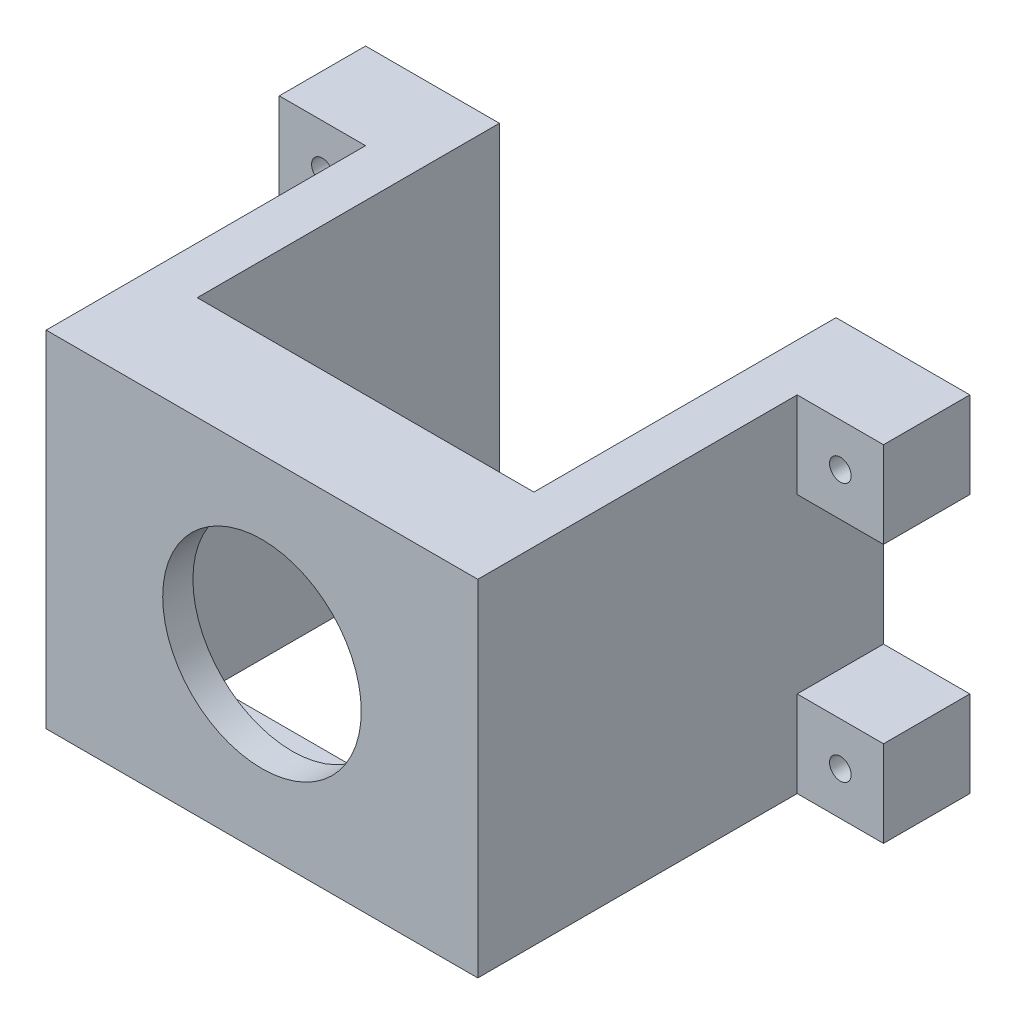
ISO-10303-21;
HEADER;
FILE_DESCRIPTION(('STEP AP214'),'2;1');
FILE_NAME('part.step','',(''),(''),'','','');
FILE_SCHEMA(('AUTOMOTIVE_DESIGN { 1 0 10303 214 1 1 1 1 }'));
ENDSEC;
DATA;
#1=APPLICATION_CONTEXT('core data for automotive mechanical design processes');
#2=APPLICATION_PROTOCOL_DEFINITION('international standard','automotive_design',2000,#1);
#3=PRODUCT_CONTEXT('',#1,'mechanical');
#4=PRODUCT('Part','Part','',(#3));
#5=PRODUCT_RELATED_PRODUCT_CATEGORY('part','',(#4));
#6=PRODUCT_DEFINITION_FORMATION('','',#4);
#7=PRODUCT_DEFINITION_CONTEXT('part definition',#1,'design');
#8=PRODUCT_DEFINITION('design','',#6,#7);
#9=PRODUCT_DEFINITION_SHAPE('','',#8);
#10=(LENGTH_UNIT() NAMED_UNIT(*) SI_UNIT(.MILLI.,.METRE.));
#11=(NAMED_UNIT(*) PLANE_ANGLE_UNIT() SI_UNIT($,.RADIAN.));
#12=(NAMED_UNIT(*) SI_UNIT($,.STERADIAN.) SOLID_ANGLE_UNIT());
#13=UNCERTAINTY_MEASURE_WITH_UNIT(LENGTH_MEASURE(1.E-05),#10,'distance_accuracy_value','');
#14=(GEOMETRIC_REPRESENTATION_CONTEXT(3) GLOBAL_UNCERTAINTY_ASSIGNED_CONTEXT((#13)) GLOBAL_UNIT_ASSIGNED_CONTEXT((#10,
#11,#12)) REPRESENTATION_CONTEXT('',''));
#15=CARTESIAN_POINT('',(0.,0.,0.));
#16=DIRECTION('',(0.,0.,1.));
#17=DIRECTION('',(1.,0.,0.));
#18=AXIS2_PLACEMENT_3D('',#15,#16,#17);
#19=CARTESIAN_POINT('',(0.,0.,0.));
#20=DIRECTION('',(0.,0.,1.));
#21=DIRECTION('',(1.,0.,0.));
#22=AXIS2_PLACEMENT_3D('',#19,#20,#21);
#23=PLANE('',#22);
#24=CARTESIAN_POINT('',(-30.,-15.,0.));
#25=DIRECTION('',(0.,0.,1.));
#26=DIRECTION('',(1.,0.,0.));
#27=AXIS2_PLACEMENT_3D('',#24,#25,#26);
#28=CIRCLE('',#27,1.25);
#29=CARTESIAN_POINT('',(-28.75,-15.,0.));
#30=VERTEX_POINT('',#29);
#31=EDGE_CURVE('E408',#30,#30,#28,.T.);
#32=ORIENTED_EDGE('',*,*,#31,.T.);
#33=EDGE_LOOP('',(#32));
#34=FACE_BOUND('',#33,.T.);
#35=CARTESIAN_POINT('',(-30.,15.,0.));
#36=DIRECTION('',(0.,0.,1.));
#37=DIRECTION('',(1.,0.,0.));
#38=AXIS2_PLACEMENT_3D('',#35,#36,#37);
#39=CIRCLE('',#38,1.25);
#40=CARTESIAN_POINT('',(-28.75,15.,0.));
#41=VERTEX_POINT('',#40);
#42=EDGE_CURVE('E361',#41,#41,#39,.T.);
#43=ORIENTED_EDGE('',*,*,#42,.T.);
#44=EDGE_LOOP('',(#43));
#45=FACE_BOUND('',#44,.T.);
#46=DIRECTION('',(-1.,0.,0.));
#47=VECTOR('',#46,1.);
#48=CARTESIAN_POINT('',(-25.,20.,0.));
#49=LINE('',#48,#47);
#50=CARTESIAN_POINT('',(-19.5,20.,0.));
#51=VERTEX_POINT('',#50);
#52=CARTESIAN_POINT('',(-35.,20.,0.));
#53=VERTEX_POINT('',#52);
#54=EDGE_CURVE('E204',#51,#53,#49,.T.);
#55=ORIENTED_EDGE('',*,*,#54,.F.);
#56=DIRECTION('',(0.,-1.,0.));
#57=VECTOR('',#56,1.);
#58=CARTESIAN_POINT('',(-19.5,18.,0.));
#59=LINE('',#58,#57);
#60=CARTESIAN_POINT('',(-19.5,-20.,0.));
#61=VERTEX_POINT('',#60);
#62=EDGE_CURVE('E215',#51,#61,#59,.T.);
#63=ORIENTED_EDGE('',*,*,#62,.T.);
#64=DIRECTION('',(1.,0.,0.));
#65=VECTOR('',#64,1.);
#66=CARTESIAN_POINT('',(-25.,-20.,0.));
#67=LINE('',#66,#65);
#68=CARTESIAN_POINT('',(-35.,-20.,0.));
#69=VERTEX_POINT('',#68);
#70=EDGE_CURVE('E237',#69,#61,#67,.T.);
#71=ORIENTED_EDGE('',*,*,#70,.F.);
#72=DIRECTION('',(0.,-1.,0.));
#73=VECTOR('',#72,1.);
#74=CARTESIAN_POINT('',(-35.,-10.,0.));
#75=LINE('',#74,#73);
#76=CARTESIAN_POINT('',(-35.,-10.,0.));
#77=VERTEX_POINT('',#76);
#78=EDGE_CURVE('E274',#77,#69,#75,.T.);
#79=ORIENTED_EDGE('',*,*,#78,.F.);
#80=DIRECTION('',(-1.,0.,0.));
#81=VECTOR('',#80,1.);
#82=CARTESIAN_POINT('',(-35.,-10.,0.));
#83=LINE('',#82,#81);
#84=CARTESIAN_POINT('',(-25.,-10.,0.));
#85=VERTEX_POINT('',#84);
#86=EDGE_CURVE('E287',#85,#77,#83,.T.);
#87=ORIENTED_EDGE('',*,*,#86,.F.);
#88=DIRECTION('',(0.,-1.,0.));
#89=VECTOR('',#88,1.);
#90=CARTESIAN_POINT('',(-25.,20.,0.));
#91=LINE('',#90,#89);
#92=CARTESIAN_POINT('',(-25.,10.,0.));
#93=VERTEX_POINT('',#92);
#94=EDGE_CURVE('E230',#93,#85,#91,.T.);
#95=ORIENTED_EDGE('',*,*,#94,.F.);
#96=DIRECTION('',(-1.,0.,0.));
#97=VECTOR('',#96,1.);
#98=CARTESIAN_POINT('',(-35.,10.,0.));
#99=LINE('',#98,#97);
#100=CARTESIAN_POINT('',(-35.,10.,0.));
#101=VERTEX_POINT('',#100);
#102=EDGE_CURVE('E363',#93,#101,#99,.T.);
#103=ORIENTED_EDGE('',*,*,#102,.T.);
#104=DIRECTION('',(0.,1.,0.));
#105=VECTOR('',#104,1.);
#106=CARTESIAN_POINT('',(-35.,10.,0.));
#107=LINE('',#106,#105);
#108=EDGE_CURVE('E226',#101,#53,#107,.T.);
#109=ORIENTED_EDGE('',*,*,#108,.T.);
#110=EDGE_LOOP('',(#55,#63,#71,#79,#87,#95,#103,#109));
#111=FACE_BOUND('',#110,.T.);
#112=ADVANCED_FACE('F42',(#34,#45,#111),#23,.F.);
#113=CARTESIAN_POINT('',(30.,-15.,0.));
#114=DIRECTION('',(0.,0.,1.));
#115=DIRECTION('',(1.,0.,0.));
#116=AXIS2_PLACEMENT_3D('',#113,#114,#115);
#117=CIRCLE('',#116,1.25);
#118=CARTESIAN_POINT('',(31.25,-15.,0.));
#119=VERTEX_POINT('',#118);
#120=EDGE_CURVE('E402',#119,#119,#117,.T.);
#121=ORIENTED_EDGE('',*,*,#120,.T.);
#122=EDGE_LOOP('',(#121));
#123=FACE_BOUND('',#122,.T.);
#124=CARTESIAN_POINT('',(30.,15.,0.));
#125=DIRECTION('',(0.,0.,1.));
#126=DIRECTION('',(1.,0.,0.));
#127=AXIS2_PLACEMENT_3D('',#124,#125,#126);
#128=CIRCLE('',#127,1.25);
#129=CARTESIAN_POINT('',(31.25,15.,0.));
#130=VERTEX_POINT('',#129);
#131=EDGE_CURVE('E811',#130,#130,#128,.T.);
#132=ORIENTED_EDGE('',*,*,#131,.T.);
#133=EDGE_LOOP('',(#132));
#134=FACE_BOUND('',#133,.T.);
#135=DIRECTION('',(0.,1.,0.));
#136=VECTOR('',#135,1.);
#137=CARTESIAN_POINT('',(19.5,18.,0.));
#138=LINE('',#137,#136);
#139=CARTESIAN_POINT('',(19.5,-20.,0.));
#140=VERTEX_POINT('',#139);
#141=CARTESIAN_POINT('',(19.5,20.,0.));
#142=VERTEX_POINT('',#141);
#143=EDGE_CURVE('E222',#140,#142,#138,.T.);
#144=ORIENTED_EDGE('',*,*,#143,.T.);
#145=CARTESIAN_POINT('',(35.,20.,0.));
#146=VERTEX_POINT('',#145);
#147=EDGE_CURVE('E227',#146,#142,#49,.T.);
#148=ORIENTED_EDGE('',*,*,#147,.F.);
#149=DIRECTION('',(0.,-1.,0.));
#150=VECTOR('',#149,1.);
#151=CARTESIAN_POINT('',(35.,10.,0.));
#152=LINE('',#151,#150);
#153=CARTESIAN_POINT('',(35.,10.,0.));
#154=VERTEX_POINT('',#153);
#155=EDGE_CURVE('E358',#146,#154,#152,.T.);
#156=ORIENTED_EDGE('',*,*,#155,.T.);
#157=CARTESIAN_POINT('',(25.,10.,0.));
#158=VERTEX_POINT('',#157);
#159=EDGE_CURVE('E348',#154,#158,#99,.T.);
#160=ORIENTED_EDGE('',*,*,#159,.T.);
#161=DIRECTION('',(0.,1.,0.));
#162=VECTOR('',#161,1.);
#163=CARTESIAN_POINT('',(25.,20.,0.));
#164=LINE('',#163,#162);
#165=CARTESIAN_POINT('',(25.,-10.,0.));
#166=VERTEX_POINT('',#165);
#167=EDGE_CURVE('E62',#166,#158,#164,.T.);
#168=ORIENTED_EDGE('',*,*,#167,.F.);
#169=CARTESIAN_POINT('',(35.,-10.,0.));
#170=VERTEX_POINT('',#169);
#171=EDGE_CURVE('E288',#170,#166,#83,.T.);
#172=ORIENTED_EDGE('',*,*,#171,.F.);
#173=DIRECTION('',(0.,1.,0.));
#174=VECTOR('',#173,1.);
#175=CARTESIAN_POINT('',(35.,-10.,0.));
#176=LINE('',#175,#174);
#177=CARTESIAN_POINT('',(35.,-20.,0.));
#178=VERTEX_POINT('',#177);
#179=EDGE_CURVE('E256',#178,#170,#176,.T.);
#180=ORIENTED_EDGE('',*,*,#179,.F.);
#181=EDGE_CURVE('E236',#140,#178,#67,.T.);
#182=ORIENTED_EDGE('',*,*,#181,.F.);
#183=EDGE_LOOP('',(#144,#148,#156,#160,#168,#172,#180,#182));
#184=FACE_BOUND('',#183,.T.);
#185=ADVANCED_FACE('F441',(#123,#134,#184),#23,.F.);
#186=CARTESIAN_POINT('',(-25.,20.,47.));
#187=DIRECTION('',(0.,-1.,0.));
#188=DIRECTION('',(0.,0.,-1.));
#189=AXIS2_PLACEMENT_3D('',#186,#187,#188);
#190=PLANE('',#189);
#191=DIRECTION('',(0.,0.,-1.));
#192=VECTOR('',#191,1.);
#193=CARTESIAN_POINT('',(-19.5,20.,47.));
#194=LINE('',#193,#192);
#195=CARTESIAN_POINT('',(-19.5,20.,35.));
#196=VERTEX_POINT('',#195);
#197=EDGE_CURVE('E200',#196,#51,#194,.T.);
#198=ORIENTED_EDGE('',*,*,#197,.T.);
#199=ORIENTED_EDGE('',*,*,#54,.T.);
#200=DIRECTION('',(0.,0.,-1.));
#201=VECTOR('',#200,1.);
#202=CARTESIAN_POINT('',(-35.,20.,10.));
#203=LINE('',#202,#201);
#204=CARTESIAN_POINT('',(-35.,20.,10.));
#205=VERTEX_POINT('',#204);
#206=EDGE_CURVE('E370',#205,#53,#203,.T.);
#207=ORIENTED_EDGE('',*,*,#206,.F.);
#208=DIRECTION('',(1.,0.,0.));
#209=VECTOR('',#208,1.);
#210=CARTESIAN_POINT('',(-35.,20.,10.));
#211=LINE('',#210,#209);
#212=CARTESIAN_POINT('',(-25.,20.,9.99999999999999));
#213=VERTEX_POINT('',#212);
#214=EDGE_CURVE('E344',#205,#213,#211,.T.);
#215=ORIENTED_EDGE('',*,*,#214,.T.);
#216=DIRECTION('',(0.,0.,-1.));
#217=VECTOR('',#216,1.);
#218=CARTESIAN_POINT('',(-25.,20.,47.));
#219=LINE('',#218,#217);
#220=CARTESIAN_POINT('',(-25.,20.,47.));
#221=VERTEX_POINT('',#220);
#222=EDGE_CURVE('E246',#221,#213,#219,.T.);
#223=ORIENTED_EDGE('',*,*,#222,.F.);
#224=DIRECTION('',(-1.,0.,0.));
#225=VECTOR('',#224,1.);
#226=CARTESIAN_POINT('',(-25.,20.,47.));
#227=LINE('',#226,#225);
#228=CARTESIAN_POINT('',(25.,20.,47.));
#229=VERTEX_POINT('',#228);
#230=EDGE_CURVE('E315',#229,#221,#227,.T.);
#231=ORIENTED_EDGE('',*,*,#230,.F.);
#232=DIRECTION('',(0.,0.,-1.));
#233=VECTOR('',#232,1.);
#234=CARTESIAN_POINT('',(25.,20.,47.));
#235=LINE('',#234,#233);
#236=CARTESIAN_POINT('',(25.,20.,9.99999999999999));
#237=VERTEX_POINT('',#236);
#238=EDGE_CURVE('E50',#229,#237,#235,.T.);
#239=ORIENTED_EDGE('',*,*,#238,.T.);
#240=CARTESIAN_POINT('',(35.,20.,10.));
#241=VERTEX_POINT('',#240);
#242=EDGE_CURVE('E334',#237,#241,#211,.T.);
#243=ORIENTED_EDGE('',*,*,#242,.T.);
#244=DIRECTION('',(0.,0.,-1.));
#245=VECTOR('',#244,1.);
#246=CARTESIAN_POINT('',(35.,20.,10.));
#247=LINE('',#246,#245);
#248=EDGE_CURVE('E372',#241,#146,#247,.T.);
#249=ORIENTED_EDGE('',*,*,#248,.T.);
#250=ORIENTED_EDGE('',*,*,#147,.T.);
#251=DIRECTION('',(0.,0.,1.));
#252=VECTOR('',#251,1.);
#253=CARTESIAN_POINT('',(19.5,20.,47.));
#254=LINE('',#253,#252);
#255=CARTESIAN_POINT('',(19.5,20.,35.));
#256=VERTEX_POINT('',#255);
#257=EDGE_CURVE('E397',#142,#256,#254,.T.);
#258=ORIENTED_EDGE('',*,*,#257,.T.);
#259=DIRECTION('',(1.,0.,0.));
#260=VECTOR('',#259,1.);
#261=CARTESIAN_POINT('',(-25.,20.,35.));
#262=LINE('',#261,#260);
#263=EDGE_CURVE('E207',#196,#256,#262,.T.);
#264=ORIENTED_EDGE('',*,*,#263,.F.);
#265=EDGE_LOOP('',(#198,#199,#207,#215,#223,#231,#239,#243,#249,#250,#258,#264));
#266=FACE_BOUND('',#265,.T.);
#267=ADVANCED_FACE('F202',(#266),#190,.F.);
#268=CARTESIAN_POINT('',(-19.5,18.,43.5));
#269=DIRECTION('',(0.,-1.,0.));
#270=DIRECTION('',(0.,0.,-1.));
#271=AXIS2_PLACEMENT_3D('',#268,#269,#270);
#272=PLANE('',#271);
#273=DIRECTION('',(0.,0.,-1.));
#274=VECTOR('',#273,1.);
#275=CARTESIAN_POINT('',(-19.5,18.,43.5));
#276=LINE('',#275,#274);
#277=CARTESIAN_POINT('',(-19.5,18.,43.5));
#278=VERTEX_POINT('',#277);
#279=CARTESIAN_POINT('',(-19.5,18.,35.));
#280=VERTEX_POINT('',#279);
#281=EDGE_CURVE('E259',#278,#280,#276,.T.);
#282=ORIENTED_EDGE('',*,*,#281,.T.);
#283=DIRECTION('',(1.,0.,0.));
#284=VECTOR('',#283,1.);
#285=CARTESIAN_POINT('',(-19.5,18.,35.));
#286=LINE('',#285,#284);
#287=CARTESIAN_POINT('',(19.5,18.,35.));
#288=VERTEX_POINT('',#287);
#289=EDGE_CURVE('E388',#280,#288,#286,.T.);
#290=ORIENTED_EDGE('',*,*,#289,.T.);
#291=DIRECTION('',(0.,0.,-1.));
#292=VECTOR('',#291,1.);
#293=CARTESIAN_POINT('',(19.5,18.,43.5));
#294=LINE('',#293,#292);
#295=CARTESIAN_POINT('',(19.5,18.,43.5));
#296=VERTEX_POINT('',#295);
#297=EDGE_CURVE('E252',#296,#288,#294,.T.);
#298=ORIENTED_EDGE('',*,*,#297,.F.);
#299=DIRECTION('',(-1.,0.,0.));
#300=VECTOR('',#299,1.);
#301=CARTESIAN_POINT('',(-19.5,18.,43.5));
#302=LINE('',#301,#300);
#303=EDGE_CURVE('E412',#296,#278,#302,.T.);
#304=ORIENTED_EDGE('',*,*,#303,.T.);
#305=EDGE_LOOP('',(#282,#290,#298,#304));
#306=FACE_BOUND('',#305,.T.);
#307=ADVANCED_FACE('F436',(#306),#272,.T.);
#308=CARTESIAN_POINT('',(-19.5,-18.,43.5));
#309=DIRECTION('',(0.,1.,0.));
#310=DIRECTION('',(0.,0.,1.));
#311=AXIS2_PLACEMENT_3D('',#308,#309,#310);
#312=PLANE('',#311);
#313=DIRECTION('',(0.,0.,-1.));
#314=VECTOR('',#313,1.);
#315=CARTESIAN_POINT('',(19.5,-18.,43.5));
#316=LINE('',#315,#314);
#317=CARTESIAN_POINT('',(19.5,-18.,43.5));
#318=VERTEX_POINT('',#317);
#319=CARTESIAN_POINT('',(19.5,-18.,35.));
#320=VERTEX_POINT('',#319);
#321=EDGE_CURVE('E418',#318,#320,#316,.T.);
#322=ORIENTED_EDGE('',*,*,#321,.T.);
#323=DIRECTION('',(-1.,0.,0.));
#324=VECTOR('',#323,1.);
#325=CARTESIAN_POINT('',(-19.5,-18.,35.));
#326=LINE('',#325,#324);
#327=CARTESIAN_POINT('',(-19.5,-18.,35.));
#328=VERTEX_POINT('',#327);
#329=EDGE_CURVE('E11',#320,#328,#326,.T.);
#330=ORIENTED_EDGE('',*,*,#329,.T.);
#331=DIRECTION('',(0.,0.,-1.));
#332=VECTOR('',#331,1.);
#333=CARTESIAN_POINT('',(-19.5,-18.,43.5));
#334=LINE('',#333,#332);
#335=CARTESIAN_POINT('',(-19.5,-18.,43.5));
#336=VERTEX_POINT('',#335);
#337=EDGE_CURVE('E266',#336,#328,#334,.T.);
#338=ORIENTED_EDGE('',*,*,#337,.F.);
#339=DIRECTION('',(1.,0.,0.));
#340=VECTOR('',#339,1.);
#341=CARTESIAN_POINT('',(-19.5,-18.,43.5));
#342=LINE('',#341,#340);
#343=EDGE_CURVE('E416',#336,#318,#342,.T.);
#344=ORIENTED_EDGE('',*,*,#343,.T.);
#345=EDGE_LOOP('',(#322,#330,#338,#344));
#346=FACE_BOUND('',#345,.T.);
#347=ADVANCED_FACE('F428',(#346),#312,.T.);
#348=CARTESIAN_POINT('',(25.,20.,47.));
#349=DIRECTION('',(-1.,0.,0.));
#350=DIRECTION('',(0.,0.,1.));
#351=AXIS2_PLACEMENT_3D('',#348,#349,#350);
#352=PLANE('',#351);
#353=ORIENTED_EDGE('',*,*,#167,.T.);
#354=DIRECTION('',(0.,0.,1.));
#355=VECTOR('',#354,1.);
#356=CARTESIAN_POINT('',(25.,10.,47.));
#357=LINE('',#356,#355);
#358=CARTESIAN_POINT('',(25.,10.,9.99999999999999));
#359=VERTEX_POINT('',#358);
#360=EDGE_CURVE('E57',#158,#359,#357,.T.);
#361=ORIENTED_EDGE('',*,*,#360,.T.);
#362=DIRECTION('',(0.,1.,0.));
#363=VECTOR('',#362,1.);
#364=CARTESIAN_POINT('',(25.,20.,9.99999999999999));
#365=LINE('',#364,#363);
#366=EDGE_CURVE('E331',#359,#237,#365,.T.);
#367=ORIENTED_EDGE('',*,*,#366,.T.);
#368=ORIENTED_EDGE('',*,*,#238,.F.);
#369=DIRECTION('',(0.,1.,0.));
#370=VECTOR('',#369,1.);
#371=CARTESIAN_POINT('',(25.,20.,47.));
#372=LINE('',#371,#370);
#373=CARTESIAN_POINT('',(25.,-20.,47.));
#374=VERTEX_POINT('',#373);
#375=EDGE_CURVE('E239',#374,#229,#372,.T.);
#376=ORIENTED_EDGE('',*,*,#375,.F.);
#377=DIRECTION('',(0.,0.,-1.));
#378=VECTOR('',#377,1.);
#379=CARTESIAN_POINT('',(25.,-20.,47.));
#380=LINE('',#379,#378);
#381=CARTESIAN_POINT('',(25.,-20.,9.99999999999999));
#382=VERTEX_POINT('',#381);
#383=EDGE_CURVE('E240',#374,#382,#380,.T.);
#384=ORIENTED_EDGE('',*,*,#383,.T.);
#385=DIRECTION('',(0.,1.,0.));
#386=VECTOR('',#385,1.);
#387=CARTESIAN_POINT('',(25.,20.,9.99999999999999));
#388=LINE('',#387,#386);
#389=CARTESIAN_POINT('',(25.,-10.,9.99999999999999));
#390=VERTEX_POINT('',#389);
#391=EDGE_CURVE('E231',#382,#390,#388,.T.);
#392=ORIENTED_EDGE('',*,*,#391,.T.);
#393=DIRECTION('',(0.,0.,1.));
#394=VECTOR('',#393,1.);
#395=CARTESIAN_POINT('',(25.,-10.,47.));
#396=LINE('',#395,#394);
#397=EDGE_CURVE('E307',#166,#390,#396,.T.);
#398=ORIENTED_EDGE('',*,*,#397,.F.);
#399=EDGE_LOOP('',(#353,#361,#367,#368,#376,#384,#392,#398));
#400=FACE_BOUND('',#399,.T.);
#401=ADVANCED_FACE('F44',(#400),#352,.F.);
#402=CARTESIAN_POINT('',(-25.,20.,47.));
#403=DIRECTION('',(1.,0.,0.));
#404=DIRECTION('',(0.,1.,0.));
#405=AXIS2_PLACEMENT_3D('',#402,#403,#404);
#406=PLANE('',#405);
#407=DIRECTION('',(0.,-1.,0.));
#408=VECTOR('',#407,1.);
#409=CARTESIAN_POINT('',(-25.,20.,9.99999999999999));
#410=LINE('',#409,#408);
#411=CARTESIAN_POINT('',(-25.,10.,9.99999999999999));
#412=VERTEX_POINT('',#411);
#413=EDGE_CURVE('E374',#213,#412,#410,.T.);
#414=ORIENTED_EDGE('',*,*,#413,.T.);
#415=DIRECTION('',(0.,0.,-1.));
#416=VECTOR('',#415,1.);
#417=CARTESIAN_POINT('',(-25.,10.,47.));
#418=LINE('',#417,#416);
#419=EDGE_CURVE('E377',#412,#93,#418,.T.);
#420=ORIENTED_EDGE('',*,*,#419,.T.);
#421=ORIENTED_EDGE('',*,*,#94,.T.);
#422=DIRECTION('',(0.,0.,-1.));
#423=VECTOR('',#422,1.);
#424=CARTESIAN_POINT('',(-25.,-10.,47.));
#425=LINE('',#424,#423);
#426=CARTESIAN_POINT('',(-25.,-10.,9.99999999999999));
#427=VERTEX_POINT('',#426);
#428=EDGE_CURVE('E304',#427,#85,#425,.T.);
#429=ORIENTED_EDGE('',*,*,#428,.F.);
#430=DIRECTION('',(0.,-1.,0.));
#431=VECTOR('',#430,1.);
#432=CARTESIAN_POINT('',(-25.,20.,9.99999999999999));
#433=LINE('',#432,#431);
#434=CARTESIAN_POINT('',(-25.,-20.,9.99999999999999));
#435=VERTEX_POINT('',#434);
#436=EDGE_CURVE('E310',#427,#435,#433,.T.);
#437=ORIENTED_EDGE('',*,*,#436,.T.);
#438=DIRECTION('',(0.,0.,-1.));
#439=VECTOR('',#438,1.);
#440=CARTESIAN_POINT('',(-25.,-20.,47.));
#441=LINE('',#440,#439);
#442=CARTESIAN_POINT('',(-25.,-20.,47.));
#443=VERTEX_POINT('',#442);
#444=EDGE_CURVE('E242',#443,#435,#441,.T.);
#445=ORIENTED_EDGE('',*,*,#444,.F.);
#446=DIRECTION('',(0.,-1.,0.));
#447=VECTOR('',#446,1.);
#448=CARTESIAN_POINT('',(-25.,20.,47.));
#449=LINE('',#448,#447);
#450=EDGE_CURVE('E317',#221,#443,#449,.T.);
#451=ORIENTED_EDGE('',*,*,#450,.F.);
#452=ORIENTED_EDGE('',*,*,#222,.T.);
#453=EDGE_LOOP('',(#414,#420,#421,#429,#437,#445,#451,#452));
#454=FACE_BOUND('',#453,.T.);
#455=ADVANCED_FACE('F474',(#454),#406,.F.);
#456=CARTESIAN_POINT('',(-25.,-20.,47.));
#457=DIRECTION('',(0.,1.,0.));
#458=DIRECTION('',(0.,0.,1.));
#459=AXIS2_PLACEMENT_3D('',#456,#457,#458);
#460=PLANE('',#459);
#461=ORIENTED_EDGE('',*,*,#70,.T.);
#462=DIRECTION('',(0.,0.,1.));
#463=VECTOR('',#462,1.);
#464=CARTESIAN_POINT('',(-19.5,-20.,47.));
#465=LINE('',#464,#463);
#466=CARTESIAN_POINT('',(-19.5,-20.,35.));
#467=VERTEX_POINT('',#466);
#468=EDGE_CURVE('E212',#61,#467,#465,.T.);
#469=ORIENTED_EDGE('',*,*,#468,.T.);
#470=DIRECTION('',(-1.,0.,0.));
#471=VECTOR('',#470,1.);
#472=CARTESIAN_POINT('',(-25.,-20.,35.));
#473=LINE('',#472,#471);
#474=CARTESIAN_POINT('',(19.5,-20.,35.));
#475=VERTEX_POINT('',#474);
#476=EDGE_CURVE('E391',#475,#467,#473,.T.);
#477=ORIENTED_EDGE('',*,*,#476,.F.);
#478=DIRECTION('',(0.,0.,-1.));
#479=VECTOR('',#478,1.);
#480=CARTESIAN_POINT('',(19.5,-20.,47.));
#481=LINE('',#480,#479);
#482=EDGE_CURVE('E394',#475,#140,#481,.T.);
#483=ORIENTED_EDGE('',*,*,#482,.T.);
#484=ORIENTED_EDGE('',*,*,#181,.T.);
#485=DIRECTION('',(0.,0.,-1.));
#486=VECTOR('',#485,1.);
#487=CARTESIAN_POINT('',(35.,-20.,10.));
#488=LINE('',#487,#486);
#489=CARTESIAN_POINT('',(35.,-20.,10.));
#490=VERTEX_POINT('',#489);
#491=EDGE_CURVE('E284',#490,#178,#488,.T.);
#492=ORIENTED_EDGE('',*,*,#491,.F.);
#493=DIRECTION('',(1.,0.,0.));
#494=VECTOR('',#493,1.);
#495=CARTESIAN_POINT('',(-35.,-20.,10.));
#496=LINE('',#495,#494);
#497=EDGE_CURVE('E280',#382,#490,#496,.T.);
#498=ORIENTED_EDGE('',*,*,#497,.F.);
#499=ORIENTED_EDGE('',*,*,#383,.F.);
#500=DIRECTION('',(1.,0.,0.));
#501=VECTOR('',#500,1.);
#502=CARTESIAN_POINT('',(-25.,-20.,47.));
#503=LINE('',#502,#501);
#504=EDGE_CURVE('E243',#443,#374,#503,.T.);
#505=ORIENTED_EDGE('',*,*,#504,.F.);
#506=ORIENTED_EDGE('',*,*,#444,.T.);
#507=CARTESIAN_POINT('',(-35.,-20.,10.));
#508=VERTEX_POINT('',#507);
#509=EDGE_CURVE('E281',#508,#435,#496,.T.);
#510=ORIENTED_EDGE('',*,*,#509,.F.);
#511=DIRECTION('',(0.,0.,-1.));
#512=VECTOR('',#511,1.);
#513=CARTESIAN_POINT('',(-35.,-20.,10.));
#514=LINE('',#513,#512);
#515=EDGE_CURVE('E295',#508,#69,#514,.T.);
#516=ORIENTED_EDGE('',*,*,#515,.T.);
#517=EDGE_LOOP('',(#461,#469,#477,#483,#484,#492,#498,#499,#505,#506,#510,#516));
#518=FACE_BOUND('',#517,.T.);
#519=ADVANCED_FACE('F328',(#518),#460,.F.);
#520=CARTESIAN_POINT('',(0.,0.,47.));
#521=DIRECTION('',(0.,0.,1.));
#522=DIRECTION('',(1.,0.,0.));
#523=AXIS2_PLACEMENT_3D('',#520,#521,#522);
#524=PLANE('',#523);
#525=CARTESIAN_POINT('',(0.,0.,47.));
#526=DIRECTION('',(0.,0.,1.));
#527=DIRECTION('',(1.,0.,0.));
#528=AXIS2_PLACEMENT_3D('',#525,#526,#527);
#529=CIRCLE('',#528,11.5);
#530=CARTESIAN_POINT('',(11.5,0.,47.));
#531=VERTEX_POINT('',#530);
#532=EDGE_CURVE('E251',#531,#531,#529,.T.);
#533=ORIENTED_EDGE('',*,*,#532,.F.);
#534=EDGE_LOOP('',(#533));
#535=FACE_BOUND('',#534,.T.);
#536=ORIENTED_EDGE('',*,*,#375,.T.);
#537=ORIENTED_EDGE('',*,*,#230,.T.);
#538=ORIENTED_EDGE('',*,*,#450,.T.);
#539=ORIENTED_EDGE('',*,*,#504,.T.);
#540=EDGE_LOOP('',(#536,#537,#538,#539));
#541=FACE_BOUND('',#540,.T.);
#542=ADVANCED_FACE('F321',(#535,#541),#524,.T.);
#543=CARTESIAN_POINT('',(-35.,-10.,10.));
#544=DIRECTION('',(1.,0.,0.));
#545=DIRECTION('',(0.,0.,-1.));
#546=AXIS2_PLACEMENT_3D('',#543,#544,#545);
#547=PLANE('',#546);
#548=ORIENTED_EDGE('',*,*,#78,.T.);
#549=ORIENTED_EDGE('',*,*,#515,.F.);
#550=DIRECTION('',(0.,-1.,0.));
#551=VECTOR('',#550,1.);
#552=CARTESIAN_POINT('',(-35.,-10.,10.));
#553=LINE('',#552,#551);
#554=CARTESIAN_POINT('',(-35.,-10.,10.));
#555=VERTEX_POINT('',#554);
#556=EDGE_CURVE('E278',#555,#508,#553,.T.);
#557=ORIENTED_EDGE('',*,*,#556,.F.);
#558=DIRECTION('',(0.,0.,-1.));
#559=VECTOR('',#558,1.);
#560=CARTESIAN_POINT('',(-35.,-10.,10.));
#561=LINE('',#560,#559);
#562=EDGE_CURVE('E298',#555,#77,#561,.T.);
#563=ORIENTED_EDGE('',*,*,#562,.T.);
#564=EDGE_LOOP('',(#548,#549,#557,#563));
#565=FACE_BOUND('',#564,.T.);
#566=ADVANCED_FACE('F502',(#565),#547,.F.);
#567=CARTESIAN_POINT('',(0.,0.,10.));
#568=DIRECTION('',(0.,0.,1.));
#569=DIRECTION('',(1.,0.,0.));
#570=AXIS2_PLACEMENT_3D('',#567,#568,#569);
#571=PLANE('',#570);
#572=CARTESIAN_POINT('',(-30.,-15.,10.));
#573=DIRECTION('',(0.,0.,1.));
#574=DIRECTION('',(1.,0.,0.));
#575=AXIS2_PLACEMENT_3D('',#572,#573,#574);
#576=CIRCLE('',#575,1.24999999999999);
#577=CARTESIAN_POINT('',(-28.75,-15.,10.));
#578=VERTEX_POINT('',#577);
#579=EDGE_CURVE('E405',#578,#578,#576,.T.);
#580=ORIENTED_EDGE('',*,*,#579,.F.);
#581=EDGE_LOOP('',(#580));
#582=FACE_BOUND('',#581,.T.);
#583=ORIENTED_EDGE('',*,*,#436,.F.);
#584=DIRECTION('',(-1.,0.,0.));
#585=VECTOR('',#584,1.);
#586=CARTESIAN_POINT('',(-35.,-10.,10.));
#587=LINE('',#586,#585);
#588=EDGE_CURVE('E273',#427,#555,#587,.T.);
#589=ORIENTED_EDGE('',*,*,#588,.T.);
#590=ORIENTED_EDGE('',*,*,#556,.T.);
#591=ORIENTED_EDGE('',*,*,#509,.T.);
#592=EDGE_LOOP('',(#583,#589,#590,#591));
#593=FACE_BOUND('',#592,.T.);
#594=ADVANCED_FACE('F501',(#582,#593),#571,.T.);
#595=CARTESIAN_POINT('',(-35.,-10.,10.));
#596=DIRECTION('',(0.,-1.,0.));
#597=DIRECTION('',(0.,0.,-1.));
#598=AXIS2_PLACEMENT_3D('',#595,#596,#597);
#599=PLANE('',#598);
#600=ORIENTED_EDGE('',*,*,#588,.F.);
#601=ORIENTED_EDGE('',*,*,#428,.T.);
#602=ORIENTED_EDGE('',*,*,#86,.T.);
#603=ORIENTED_EDGE('',*,*,#562,.F.);
#604=EDGE_LOOP('',(#600,#601,#602,#603));
#605=FACE_BOUND('',#604,.T.);
#606=ADVANCED_FACE('F499',(#605),#599,.F.);
#607=CARTESIAN_POINT('',(30.,-15.,10.));
#608=DIRECTION('',(0.,0.,1.));
#609=DIRECTION('',(1.,0.,0.));
#610=AXIS2_PLACEMENT_3D('',#607,#608,#609);
#611=CIRCLE('',#610,1.24999999999999);
#612=CARTESIAN_POINT('',(31.25,-15.,10.));
#613=VERTEX_POINT('',#612);
#614=EDGE_CURVE('E211',#613,#613,#611,.T.);
#615=ORIENTED_EDGE('',*,*,#614,.F.);
#616=EDGE_LOOP('',(#615));
#617=FACE_BOUND('',#616,.T.);
#618=ORIENTED_EDGE('',*,*,#391,.F.);
#619=ORIENTED_EDGE('',*,*,#497,.T.);
#620=DIRECTION('',(0.,1.,0.));
#621=VECTOR('',#620,1.);
#622=CARTESIAN_POINT('',(35.,-10.,10.));
#623=LINE('',#622,#621);
#624=CARTESIAN_POINT('',(35.,-10.,10.));
#625=VERTEX_POINT('',#624);
#626=EDGE_CURVE('E270',#490,#625,#623,.T.);
#627=ORIENTED_EDGE('',*,*,#626,.T.);
#628=EDGE_CURVE('E275',#625,#390,#587,.T.);
#629=ORIENTED_EDGE('',*,*,#628,.T.);
#630=EDGE_LOOP('',(#618,#619,#627,#629));
#631=FACE_BOUND('',#630,.T.);
#632=ADVANCED_FACE('F495',(#617,#631),#571,.T.);
#633=ORIENTED_EDGE('',*,*,#171,.T.);
#634=ORIENTED_EDGE('',*,*,#397,.T.);
#635=ORIENTED_EDGE('',*,*,#628,.F.);
#636=DIRECTION('',(0.,0.,-1.));
#637=VECTOR('',#636,1.);
#638=CARTESIAN_POINT('',(35.,-10.,10.));
#639=LINE('',#638,#637);
#640=EDGE_CURVE('E301',#625,#170,#639,.T.);
#641=ORIENTED_EDGE('',*,*,#640,.T.);
#642=EDGE_LOOP('',(#633,#634,#635,#641));
#643=FACE_BOUND('',#642,.T.);
#644=ADVANCED_FACE('F498',(#643),#599,.F.);
#645=CARTESIAN_POINT('',(35.,-10.,10.));
#646=DIRECTION('',(-1.,0.,0.));
#647=DIRECTION('',(0.,-1.,0.));
#648=AXIS2_PLACEMENT_3D('',#645,#646,#647);
#649=PLANE('',#648);
#650=ORIENTED_EDGE('',*,*,#179,.T.);
#651=ORIENTED_EDGE('',*,*,#640,.F.);
#652=ORIENTED_EDGE('',*,*,#626,.F.);
#653=ORIENTED_EDGE('',*,*,#491,.T.);
#654=EDGE_LOOP('',(#650,#651,#652,#653));
#655=FACE_BOUND('',#654,.T.);
#656=ADVANCED_FACE('F493',(#655),#649,.F.);
#657=CARTESIAN_POINT('',(0.,0.,47.));
#658=DIRECTION('',(0.,0.,-1.));
#659=DIRECTION('',(-1.,0.,0.));
#660=AXIS2_PLACEMENT_3D('',#657,#658,#659);
#661=CYLINDRICAL_SURFACE('',#660,11.5);
#662=CARTESIAN_POINT('',(0.,0.,43.5));
#663=DIRECTION('',(0.,0.,1.));
#664=DIRECTION('',(1.,0.,0.));
#665=AXIS2_PLACEMENT_3D('',#662,#663,#664);
#666=CIRCLE('',#665,11.5);
#667=CARTESIAN_POINT('',(11.5,0.,43.5));
#668=VERTEX_POINT('',#667);
#669=EDGE_CURVE('E249',#668,#668,#666,.T.);
#670=ORIENTED_EDGE('',*,*,#669,.F.);
#671=EDGE_LOOP('',(#670));
#672=FACE_BOUND('',#671,.T.);
#673=ORIENTED_EDGE('',*,*,#532,.T.);
#674=EDGE_LOOP('',(#673));
#675=FACE_BOUND('',#674,.T.);
#676=ADVANCED_FACE('F490',(#672,#675),#661,.F.);
#677=CARTESIAN_POINT('',(19.5,18.,43.5));
#678=DIRECTION('',(-1.,0.,0.));
#679=DIRECTION('',(0.,-1.,0.));
#680=AXIS2_PLACEMENT_3D('',#677,#678,#679);
#681=PLANE('',#680);
#682=ORIENTED_EDGE('',*,*,#257,.F.);
#683=ORIENTED_EDGE('',*,*,#143,.F.);
#684=ORIENTED_EDGE('',*,*,#482,.F.);
#685=DIRECTION('',(0.,-1.,0.));
#686=VECTOR('',#685,1.);
#687=CARTESIAN_POINT('',(19.5,35.,35.));
#688=LINE('',#687,#686);
#689=EDGE_CURVE('E384',#320,#475,#688,.T.);
#690=ORIENTED_EDGE('',*,*,#689,.F.);
#691=ORIENTED_EDGE('',*,*,#321,.F.);
#692=DIRECTION('',(0.,1.,0.));
#693=VECTOR('',#692,1.);
#694=CARTESIAN_POINT('',(19.5,18.,43.5));
#695=LINE('',#694,#693);
#696=EDGE_CURVE('E221',#318,#296,#695,.T.);
#697=ORIENTED_EDGE('',*,*,#696,.T.);
#698=ORIENTED_EDGE('',*,*,#297,.T.);
#699=EDGE_CURVE('E387',#256,#288,#688,.T.);
#700=ORIENTED_EDGE('',*,*,#699,.F.);
#701=EDGE_LOOP('',(#682,#683,#684,#690,#691,#697,#698,#700));
#702=FACE_BOUND('',#701,.T.);
#703=ADVANCED_FACE('F433',(#702),#681,.T.);
#704=CARTESIAN_POINT('',(-19.5,18.,43.5));
#705=DIRECTION('',(1.,0.,0.));
#706=DIRECTION('',(0.,1.,0.));
#707=AXIS2_PLACEMENT_3D('',#704,#705,#706);
#708=PLANE('',#707);
#709=DIRECTION('',(0.,1.,0.));
#710=VECTOR('',#709,1.);
#711=CARTESIAN_POINT('',(-19.5,35.,35.));
#712=LINE('',#711,#710);
#713=EDGE_CURVE('E381',#280,#196,#712,.T.);
#714=ORIENTED_EDGE('',*,*,#713,.F.);
#715=ORIENTED_EDGE('',*,*,#281,.F.);
#716=DIRECTION('',(0.,-1.,0.));
#717=VECTOR('',#716,1.);
#718=CARTESIAN_POINT('',(-19.5,18.,43.5));
#719=LINE('',#718,#717);
#720=EDGE_CURVE('E414',#278,#336,#719,.T.);
#721=ORIENTED_EDGE('',*,*,#720,.T.);
#722=ORIENTED_EDGE('',*,*,#337,.T.);
#723=EDGE_CURVE('E383',#467,#328,#712,.T.);
#724=ORIENTED_EDGE('',*,*,#723,.F.);
#725=ORIENTED_EDGE('',*,*,#468,.F.);
#726=ORIENTED_EDGE('',*,*,#62,.F.);
#727=ORIENTED_EDGE('',*,*,#197,.F.);
#728=EDGE_LOOP('',(#714,#715,#721,#722,#724,#725,#726,#727));
#729=FACE_BOUND('',#728,.T.);
#730=ADVANCED_FACE('F216',(#729),#708,.T.);
#731=CARTESIAN_POINT('',(0.,0.,43.5));
#732=DIRECTION('',(0.,0.,1.));
#733=DIRECTION('',(1.,0.,0.));
#734=AXIS2_PLACEMENT_3D('',#731,#732,#733);
#735=PLANE('',#734);
#736=ORIENTED_EDGE('',*,*,#669,.T.);
#737=EDGE_LOOP('',(#736));
#738=FACE_BOUND('',#737,.T.);
#739=ORIENTED_EDGE('',*,*,#696,.F.);
#740=ORIENTED_EDGE('',*,*,#343,.F.);
#741=ORIENTED_EDGE('',*,*,#720,.F.);
#742=ORIENTED_EDGE('',*,*,#303,.F.);
#743=EDGE_LOOP('',(#739,#740,#741,#742));
#744=FACE_BOUND('',#743,.T.);
#745=ADVANCED_FACE('F432',(#738,#744),#735,.F.);
#746=CARTESIAN_POINT('',(-30.,-15.,10.));
#747=DIRECTION('',(0.,0.,1.));
#748=DIRECTION('',(1.,0.,0.));
#749=AXIS2_PLACEMENT_3D('',#746,#747,#748);
#750=CYLINDRICAL_SURFACE('',#749,1.24999999999999);
#751=ORIENTED_EDGE('',*,*,#31,.F.);
#752=EDGE_LOOP('',(#751));
#753=FACE_BOUND('',#752,.T.);
#754=ORIENTED_EDGE('',*,*,#579,.T.);
#755=EDGE_LOOP('',(#754));
#756=FACE_BOUND('',#755,.T.);
#757=ADVANCED_FACE('F526',(#753,#756),#750,.F.);
#758=CARTESIAN_POINT('',(30.,-15.,10.));
#759=DIRECTION('',(0.,0.,1.));
#760=DIRECTION('',(1.,0.,0.));
#761=AXIS2_PLACEMENT_3D('',#758,#759,#760);
#762=CYLINDRICAL_SURFACE('',#761,1.24999999999999);
#763=ORIENTED_EDGE('',*,*,#120,.F.);
#764=EDGE_LOOP('',(#763));
#765=FACE_BOUND('',#764,.T.);
#766=ORIENTED_EDGE('',*,*,#614,.T.);
#767=EDGE_LOOP('',(#766));
#768=FACE_BOUND('',#767,.T.);
#769=ADVANCED_FACE('F519',(#765,#768),#762,.F.);
#770=CARTESIAN_POINT('',(0.,0.,35.));
#771=DIRECTION('',(0.,0.,-1.));
#772=DIRECTION('',(-1.,0.,0.));
#773=AXIS2_PLACEMENT_3D('',#770,#771,#772);
#774=PLANE('',#773);
#775=ORIENTED_EDGE('',*,*,#476,.T.);
#776=ORIENTED_EDGE('',*,*,#723,.T.);
#777=ORIENTED_EDGE('',*,*,#329,.F.);
#778=ORIENTED_EDGE('',*,*,#689,.T.);
#779=EDGE_LOOP('',(#775,#776,#777,#778));
#780=FACE_BOUND('',#779,.T.);
#781=ADVANCED_FACE('F517',(#780),#774,.T.);
#782=ORIENTED_EDGE('',*,*,#263,.T.);
#783=ORIENTED_EDGE('',*,*,#699,.T.);
#784=ORIENTED_EDGE('',*,*,#289,.F.);
#785=ORIENTED_EDGE('',*,*,#713,.T.);
#786=EDGE_LOOP('',(#782,#783,#784,#785));
#787=FACE_BOUND('',#786,.T.);
#788=ADVANCED_FACE('F438',(#787),#774,.T.);
#789=CARTESIAN_POINT('',(-35.,10.,10.));
#790=DIRECTION('',(-1.,0.,0.));
#791=DIRECTION('',(0.,0.,1.));
#792=AXIS2_PLACEMENT_3D('',#789,#790,#791);
#793=PLANE('',#792);
#794=ORIENTED_EDGE('',*,*,#108,.F.);
#795=DIRECTION('',(0.,0.,-1.));
#796=VECTOR('',#795,1.);
#797=CARTESIAN_POINT('',(-35.,10.,10.));
#798=LINE('',#797,#796);
#799=CARTESIAN_POINT('',(-35.,10.,10.));
#800=VERTEX_POINT('',#799);
#801=EDGE_CURVE('E367',#800,#101,#798,.T.);
#802=ORIENTED_EDGE('',*,*,#801,.F.);
#803=DIRECTION('',(0.,1.,0.));
#804=VECTOR('',#803,1.);
#805=CARTESIAN_POINT('',(-35.,10.,10.));
#806=LINE('',#805,#804);
#807=EDGE_CURVE('E347',#800,#205,#806,.T.);
#808=ORIENTED_EDGE('',*,*,#807,.T.);
#809=ORIENTED_EDGE('',*,*,#206,.T.);
#810=EDGE_LOOP('',(#794,#802,#808,#809));
#811=FACE_BOUND('',#810,.T.);
#812=ADVANCED_FACE('F525',(#811),#793,.T.);
#813=CARTESIAN_POINT('',(0.,0.,10.));
#814=DIRECTION('',(0.,0.,1.));
#815=DIRECTION('',(1.,0.,0.));
#816=AXIS2_PLACEMENT_3D('',#813,#814,#815);
#817=PLANE('',#816);
#818=CARTESIAN_POINT('',(-30.,15.,10.));
#819=DIRECTION('',(0.,0.,1.));
#820=DIRECTION('',(1.,0.,0.));
#821=AXIS2_PLACEMENT_3D('',#818,#819,#820);
#822=CIRCLE('',#821,1.24999999999999);
#823=CARTESIAN_POINT('',(-28.75,15.,10.));
#824=VERTEX_POINT('',#823);
#825=EDGE_CURVE('E816',#824,#824,#822,.T.);
#826=ORIENTED_EDGE('',*,*,#825,.F.);
#827=EDGE_LOOP('',(#826));
#828=FACE_BOUND('',#827,.T.);
#829=ORIENTED_EDGE('',*,*,#413,.F.);
#830=ORIENTED_EDGE('',*,*,#214,.F.);
#831=ORIENTED_EDGE('',*,*,#807,.F.);
#832=DIRECTION('',(-1.,0.,0.));
#833=VECTOR('',#832,1.);
#834=CARTESIAN_POINT('',(-35.,10.,10.));
#835=LINE('',#834,#833);
#836=EDGE_CURVE('E354',#412,#800,#835,.T.);
#837=ORIENTED_EDGE('',*,*,#836,.F.);
#838=EDGE_LOOP('',(#829,#830,#831,#837));
#839=FACE_BOUND('',#838,.T.);
#840=ADVANCED_FACE('F458',(#828,#839),#817,.T.);
#841=CARTESIAN_POINT('',(-35.,10.,10.));
#842=DIRECTION('',(0.,-1.,0.));
#843=DIRECTION('',(0.,0.,-1.));
#844=AXIS2_PLACEMENT_3D('',#841,#842,#843);
#845=PLANE('',#844);
#846=ORIENTED_EDGE('',*,*,#419,.F.);
#847=ORIENTED_EDGE('',*,*,#836,.T.);
#848=ORIENTED_EDGE('',*,*,#801,.T.);
#849=ORIENTED_EDGE('',*,*,#102,.F.);
#850=EDGE_LOOP('',(#846,#847,#848,#849));
#851=FACE_BOUND('',#850,.T.);
#852=ADVANCED_FACE('F450',(#851),#845,.T.);
#853=ORIENTED_EDGE('',*,*,#360,.F.);
#854=ORIENTED_EDGE('',*,*,#159,.F.);
#855=DIRECTION('',(0.,0.,-1.));
#856=VECTOR('',#855,1.);
#857=CARTESIAN_POINT('',(35.,10.,10.));
#858=LINE('',#857,#856);
#859=CARTESIAN_POINT('',(35.,10.,10.));
#860=VERTEX_POINT('',#859);
#861=EDGE_CURVE('E357',#860,#154,#858,.T.);
#862=ORIENTED_EDGE('',*,*,#861,.F.);
#863=EDGE_CURVE('E355',#860,#359,#835,.T.);
#864=ORIENTED_EDGE('',*,*,#863,.T.);
#865=EDGE_LOOP('',(#853,#854,#862,#864));
#866=FACE_BOUND('',#865,.T.);
#867=ADVANCED_FACE('F448',(#866),#845,.T.);
#868=CARTESIAN_POINT('',(30.,15.,10.));
#869=DIRECTION('',(0.,0.,1.));
#870=DIRECTION('',(1.,0.,0.));
#871=AXIS2_PLACEMENT_3D('',#868,#869,#870);
#872=CIRCLE('',#871,1.24999999999999);
#873=CARTESIAN_POINT('',(31.25,15.,10.));
#874=VERTEX_POINT('',#873);
#875=EDGE_CURVE('E814',#874,#874,#872,.T.);
#876=ORIENTED_EDGE('',*,*,#875,.F.);
#877=EDGE_LOOP('',(#876));
#878=FACE_BOUND('',#877,.T.);
#879=ORIENTED_EDGE('',*,*,#366,.F.);
#880=ORIENTED_EDGE('',*,*,#863,.F.);
#881=DIRECTION('',(0.,-1.,0.));
#882=VECTOR('',#881,1.);
#883=CARTESIAN_POINT('',(35.,10.,10.));
#884=LINE('',#883,#882);
#885=EDGE_CURVE('E343',#241,#860,#884,.T.);
#886=ORIENTED_EDGE('',*,*,#885,.F.);
#887=ORIENTED_EDGE('',*,*,#242,.F.);
#888=EDGE_LOOP('',(#879,#880,#886,#887));
#889=FACE_BOUND('',#888,.T.);
#890=ADVANCED_FACE('F339',(#878,#889),#817,.T.);
#891=CARTESIAN_POINT('',(35.,10.,10.));
#892=DIRECTION('',(1.,0.,0.));
#893=DIRECTION('',(0.,1.,0.));
#894=AXIS2_PLACEMENT_3D('',#891,#892,#893);
#895=PLANE('',#894);
#896=ORIENTED_EDGE('',*,*,#155,.F.);
#897=ORIENTED_EDGE('',*,*,#248,.F.);
#898=ORIENTED_EDGE('',*,*,#885,.T.);
#899=ORIENTED_EDGE('',*,*,#861,.T.);
#900=EDGE_LOOP('',(#896,#897,#898,#899));
#901=FACE_BOUND('',#900,.T.);
#902=ADVANCED_FACE('F445',(#901),#895,.T.);
#903=CARTESIAN_POINT('',(-30.,15.,10.));
#904=DIRECTION('',(0.,0.,1.));
#905=DIRECTION('',(1.,0.,0.));
#906=AXIS2_PLACEMENT_3D('',#903,#904,#905);
#907=CYLINDRICAL_SURFACE('',#906,1.24999999999999);
#908=ORIENTED_EDGE('',*,*,#42,.F.);
#909=EDGE_LOOP('',(#908));
#910=FACE_BOUND('',#909,.T.);
#911=ORIENTED_EDGE('',*,*,#825,.T.);
#912=EDGE_LOOP('',(#911));
#913=FACE_BOUND('',#912,.T.);
#914=ADVANCED_FACE('F741',(#910,#913),#907,.F.);
#915=CARTESIAN_POINT('',(30.,15.,10.));
#916=DIRECTION('',(0.,0.,1.));
#917=DIRECTION('',(1.,0.,0.));
#918=AXIS2_PLACEMENT_3D('',#915,#916,#917);
#919=CYLINDRICAL_SURFACE('',#918,1.24999999999999);
#920=ORIENTED_EDGE('',*,*,#131,.F.);
#921=EDGE_LOOP('',(#920));
#922=FACE_BOUND('',#921,.T.);
#923=ORIENTED_EDGE('',*,*,#875,.T.);
#924=EDGE_LOOP('',(#923));
#925=FACE_BOUND('',#924,.T.);
#926=ADVANCED_FACE('F791',(#922,#925),#919,.F.);
#927=CLOSED_SHELL('',(#112,#185,#267,#307,#347,#401,#455,#519,#542,#566,#594,#606,#632,#644,
#656,#676,#703,#730,#745,#757,#769,#781,#788,#812,#840,#852,#867,#890,#902,#914,#926));
#928=MANIFOLD_SOLID_BREP('B2',#927);
#929=ADVANCED_BREP_SHAPE_REPRESENTATION('',(#18,#928),#14);
#930=SHAPE_DEFINITION_REPRESENTATION(#9,#929);
ENDSEC;
END-ISO-10303-21;
